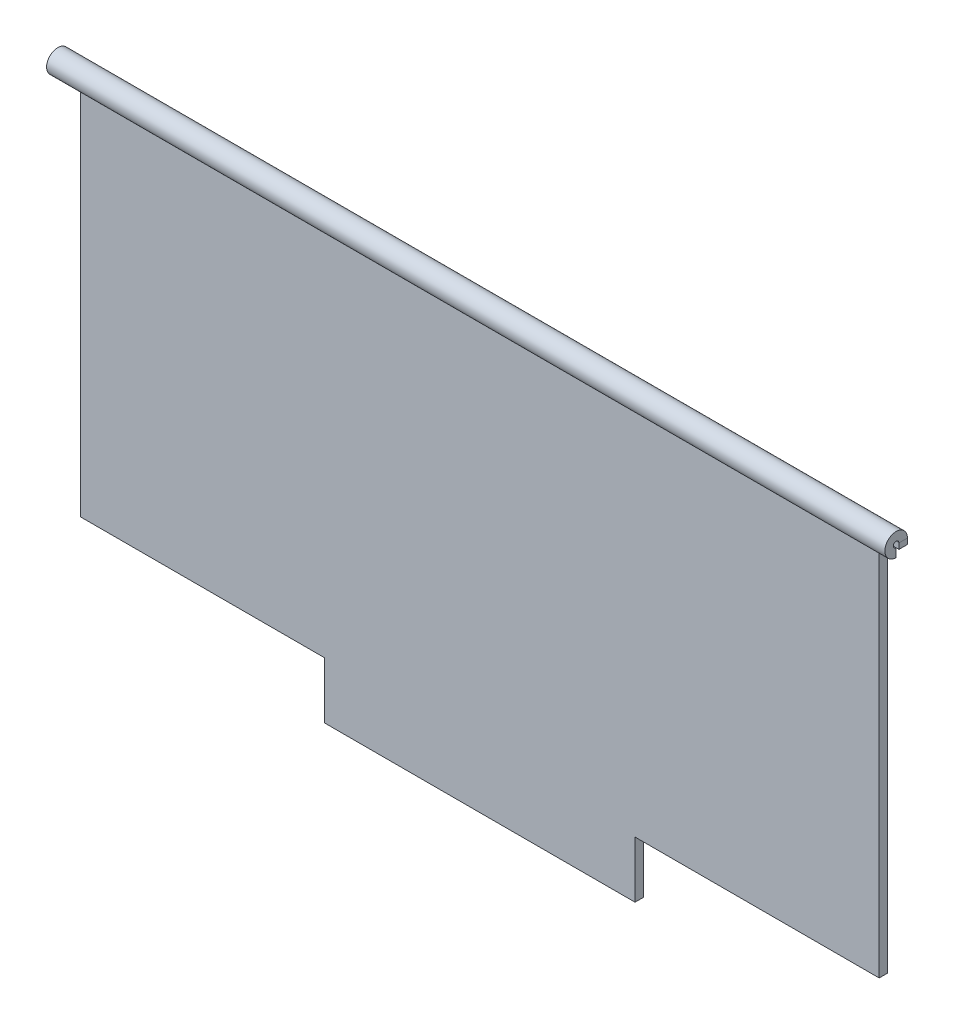
ISO-10303-21;
HEADER;
FILE_DESCRIPTION(('STEP AP214'),'2;1');
FILE_NAME('part.step','',(''),(''),'','','');
FILE_SCHEMA(('AUTOMOTIVE_DESIGN { 1 0 10303 214 1 1 1 1 }'));
ENDSEC;
DATA;
#1=APPLICATION_CONTEXT('core data for automotive mechanical design processes');
#2=APPLICATION_PROTOCOL_DEFINITION('international standard','automotive_design',2000,#1);
#3=PRODUCT_CONTEXT('',#1,'mechanical');
#4=PRODUCT('Part','Part','',(#3));
#5=PRODUCT_RELATED_PRODUCT_CATEGORY('part','',(#4));
#6=PRODUCT_DEFINITION_FORMATION('','',#4);
#7=PRODUCT_DEFINITION_CONTEXT('part definition',#1,'design');
#8=PRODUCT_DEFINITION('design','',#6,#7);
#9=PRODUCT_DEFINITION_SHAPE('','',#8);
#10=(LENGTH_UNIT() NAMED_UNIT(*) SI_UNIT(.MILLI.,.METRE.));
#11=(NAMED_UNIT(*) PLANE_ANGLE_UNIT() SI_UNIT($,.RADIAN.));
#12=(NAMED_UNIT(*) SI_UNIT($,.STERADIAN.) SOLID_ANGLE_UNIT());
#13=UNCERTAINTY_MEASURE_WITH_UNIT(LENGTH_MEASURE(1.E-05),#10,'distance_accuracy_value','');
#14=(GEOMETRIC_REPRESENTATION_CONTEXT(3) GLOBAL_UNCERTAINTY_ASSIGNED_CONTEXT((#13)) GLOBAL_UNIT_ASSIGNED_CONTEXT((#10,
#11,#12)) REPRESENTATION_CONTEXT('',''));
#15=CARTESIAN_POINT('',(0.,0.,0.));
#16=DIRECTION('',(0.,0.,1.));
#17=DIRECTION('',(1.,0.,0.));
#18=AXIS2_PLACEMENT_3D('',#15,#16,#17);
#19=CARTESIAN_POINT('',(-185.000354829546,-102.314393939394,-3.));
#20=DIRECTION('',(-1.,0.,0.));
#21=DIRECTION('',(0.,0.,1.));
#22=AXIS2_PLACEMENT_3D('',#19,#20,#21);
#23=PLANE('',#22);
#24=DIRECTION('',(0.,-1.,0.));
#25=VECTOR('',#24,1.);
#26=CARTESIAN_POINT('',(-185.000354829546,-102.314393939394,0.));
#27=LINE('',#26,#25);
#28=CARTESIAN_POINT('',(-185.000354829546,-106.314393939394,0.));
#29=VERTEX_POINT('',#28);
#30=CARTESIAN_POINT('',(-185.000354829546,-108.314393939394,0.));
#31=VERTEX_POINT('',#30);
#32=EDGE_CURVE('E109',#29,#31,#27,.T.);
#33=ORIENTED_EDGE('',*,*,#32,.F.);
#34=DIRECTION('',(0.,0.,-1.));
#35=VECTOR('',#34,1.);
#36=CARTESIAN_POINT('',(-185.000354829546,-106.314393939394,0.));
#37=LINE('',#36,#35);
#38=CARTESIAN_POINT('',(-185.000354829546,-106.314393939394,-3.));
#39=VERTEX_POINT('',#38);
#40=EDGE_CURVE('E439',#29,#39,#37,.T.);
#41=ORIENTED_EDGE('',*,*,#40,.T.);
#42=DIRECTION('',(0.,-1.,0.));
#43=VECTOR('',#42,1.);
#44=CARTESIAN_POINT('',(-185.000354829546,-102.314393939394,-3.));
#45=LINE('',#44,#43);
#46=CARTESIAN_POINT('',(-185.000354829546,-108.314393939394,-3.));
#47=VERTEX_POINT('',#46);
#48=EDGE_CURVE('E68',#39,#47,#45,.T.);
#49=ORIENTED_EDGE('',*,*,#48,.T.);
#50=DIRECTION('',(0.,0.,1.));
#51=VECTOR('',#50,1.);
#52=CARTESIAN_POINT('',(-185.000354829546,-108.314393939394,-3.));
#53=LINE('',#52,#51);
#54=EDGE_CURVE('E11',#47,#31,#53,.T.);
#55=ORIENTED_EDGE('',*,*,#54,.T.);
#56=EDGE_LOOP('',(#33,#41,#49,#55));
#57=FACE_BOUND('',#56,.T.);
#58=ADVANCED_FACE('F43',(#57),#23,.T.);
#59=CARTESIAN_POINT('',(-185.000354829546,-108.314393939394,-3.));
#60=DIRECTION('',(0.,-1.,0.));
#61=DIRECTION('',(0.,0.,-1.));
#62=AXIS2_PLACEMENT_3D('',#59,#60,#61);
#63=PLANE('',#62);
#64=DIRECTION('',(1.,0.,0.));
#65=VECTOR('',#64,1.);
#66=CARTESIAN_POINT('',(-185.000354829546,-108.314393939394,0.));
#67=LINE('',#66,#65);
#68=CARTESIAN_POINT('',(-178.000354829546,-108.314393939394,0.));
#69=VERTEX_POINT('',#68);
#70=EDGE_CURVE('E173',#31,#69,#67,.T.);
#71=ORIENTED_EDGE('',*,*,#70,.F.);
#72=ORIENTED_EDGE('',*,*,#54,.F.);
#73=DIRECTION('',(1.,0.,0.));
#74=VECTOR('',#73,1.);
#75=CARTESIAN_POINT('',(-185.000354829546,-108.314393939394,-3.));
#76=LINE('',#75,#74);
#77=CARTESIAN_POINT('',(-178.000354829546,-108.314393939394,-3.));
#78=VERTEX_POINT('',#77);
#79=EDGE_CURVE('E200',#47,#78,#76,.T.);
#80=ORIENTED_EDGE('',*,*,#79,.T.);
#81=DIRECTION('',(0.,0.,1.));
#82=VECTOR('',#81,1.);
#83=CARTESIAN_POINT('',(-178.000354829546,-108.314393939394,-3.));
#84=LINE('',#83,#82);
#85=EDGE_CURVE('E47',#78,#69,#84,.T.);
#86=ORIENTED_EDGE('',*,*,#85,.T.);
#87=EDGE_LOOP('',(#71,#72,#80,#86));
#88=FACE_BOUND('',#87,.T.);
#89=ADVANCED_FACE('F45',(#88),#63,.T.);
#90=CARTESIAN_POINT('',(111.999645170454,-102.314393939394,-3.));
#91=DIRECTION('',(1.,0.,0.));
#92=DIRECTION('',(0.,0.,-1.));
#93=AXIS2_PLACEMENT_3D('',#90,#91,#92);
#94=PLANE('',#93);
#95=DIRECTION('',(0.,0.,-1.));
#96=VECTOR('',#95,1.);
#97=CARTESIAN_POINT('',(111.999645170454,-106.314393939394,0.));
#98=LINE('',#97,#96);
#99=CARTESIAN_POINT('',(111.999645170454,-106.314393939394,0.));
#100=VERTEX_POINT('',#99);
#101=CARTESIAN_POINT('',(111.999645170454,-106.314393939394,-3.));
#102=VERTEX_POINT('',#101);
#103=EDGE_CURVE('E432',#100,#102,#98,.T.);
#104=ORIENTED_EDGE('',*,*,#103,.F.);
#105=DIRECTION('',(0.,1.,0.));
#106=VECTOR('',#105,1.);
#107=CARTESIAN_POINT('',(111.999645170454,-102.314393939394,0.));
#108=LINE('',#107,#106);
#109=CARTESIAN_POINT('',(111.999645170454,-108.314393939394,0.));
#110=VERTEX_POINT('',#109);
#111=EDGE_CURVE('E197',#110,#100,#108,.T.);
#112=ORIENTED_EDGE('',*,*,#111,.F.);
#113=DIRECTION('',(0.,0.,1.));
#114=VECTOR('',#113,1.);
#115=CARTESIAN_POINT('',(111.999645170454,-108.314393939394,-3.));
#116=LINE('',#115,#114);
#117=CARTESIAN_POINT('',(111.999645170454,-108.314393939394,-3.));
#118=VERTEX_POINT('',#117);
#119=EDGE_CURVE('E52',#118,#110,#116,.T.);
#120=ORIENTED_EDGE('',*,*,#119,.F.);
#121=DIRECTION('',(0.,1.,0.));
#122=VECTOR('',#121,1.);
#123=CARTESIAN_POINT('',(111.999645170454,-102.314393939394,-3.));
#124=LINE('',#123,#122);
#125=EDGE_CURVE('E162',#118,#102,#124,.T.);
#126=ORIENTED_EDGE('',*,*,#125,.T.);
#127=EDGE_LOOP('',(#104,#112,#120,#126));
#128=FACE_BOUND('',#127,.T.);
#129=ADVANCED_FACE('F239',(#128),#94,.T.);
#130=CARTESIAN_POINT('',(104.999645170454,-108.314393939394,-3.));
#131=DIRECTION('',(0.,-1.,0.));
#132=DIRECTION('',(0.,0.,-1.));
#133=AXIS2_PLACEMENT_3D('',#130,#131,#132);
#134=PLANE('',#133);
#135=DIRECTION('',(1.,0.,0.));
#136=VECTOR('',#135,1.);
#137=CARTESIAN_POINT('',(104.999645170454,-108.314393939394,0.));
#138=LINE('',#137,#136);
#139=CARTESIAN_POINT('',(104.999645170454,-108.314393939394,0.));
#140=VERTEX_POINT('',#139);
#141=EDGE_CURVE('E146',#140,#110,#138,.T.);
#142=ORIENTED_EDGE('',*,*,#141,.F.);
#143=DIRECTION('',(0.,0.,1.));
#144=VECTOR('',#143,1.);
#145=CARTESIAN_POINT('',(104.999645170454,-108.314393939394,-3.));
#146=LINE('',#145,#144);
#147=CARTESIAN_POINT('',(104.999645170454,-108.314393939394,-3.));
#148=VERTEX_POINT('',#147);
#149=EDGE_CURVE('E141',#148,#140,#146,.T.);
#150=ORIENTED_EDGE('',*,*,#149,.F.);
#151=DIRECTION('',(1.,0.,0.));
#152=VECTOR('',#151,1.);
#153=CARTESIAN_POINT('',(104.999645170454,-108.314393939394,-3.));
#154=LINE('',#153,#152);
#155=EDGE_CURVE('E144',#148,#118,#154,.T.);
#156=ORIENTED_EDGE('',*,*,#155,.T.);
#157=ORIENTED_EDGE('',*,*,#119,.T.);
#158=EDGE_LOOP('',(#142,#150,#156,#157));
#159=FACE_BOUND('',#158,.T.);
#160=ADVANCED_FACE('F143',(#159),#134,.T.);
#161=CARTESIAN_POINT('',(104.999645170454,-108.314393939394,-3.));
#162=DIRECTION('',(1.,0.,0.));
#163=DIRECTION('',(0.,0.,-1.));
#164=AXIS2_PLACEMENT_3D('',#161,#162,#163);
#165=PLANE('',#164);
#166=DIRECTION('',(0.,1.,0.));
#167=VECTOR('',#166,1.);
#168=CARTESIAN_POINT('',(104.999645170454,-108.314393939394,0.));
#169=LINE('',#168,#167);
#170=CARTESIAN_POINT('',(104.999645170454,-243.314393939394,0.));
#171=VERTEX_POINT('',#170);
#172=EDGE_CURVE('E194',#171,#140,#169,.T.);
#173=ORIENTED_EDGE('',*,*,#172,.F.);
#174=DIRECTION('',(0.,0.,1.));
#175=VECTOR('',#174,1.);
#176=CARTESIAN_POINT('',(104.999645170454,-243.314393939394,-3.));
#177=LINE('',#176,#175);
#178=CARTESIAN_POINT('',(104.999645170454,-243.314393939394,-3.));
#179=VERTEX_POINT('',#178);
#180=EDGE_CURVE('E151',#179,#171,#177,.T.);
#181=ORIENTED_EDGE('',*,*,#180,.F.);
#182=DIRECTION('',(0.,1.,0.));
#183=VECTOR('',#182,1.);
#184=CARTESIAN_POINT('',(104.999645170454,-108.314393939394,-3.));
#185=LINE('',#184,#183);
#186=EDGE_CURVE('E159',#179,#148,#185,.T.);
#187=ORIENTED_EDGE('',*,*,#186,.T.);
#188=ORIENTED_EDGE('',*,*,#149,.T.);
#189=EDGE_LOOP('',(#173,#181,#187,#188));
#190=FACE_BOUND('',#189,.T.);
#191=ADVANCED_FACE('F164',(#190),#165,.T.);
#192=CARTESIAN_POINT('',(18.4996451704545,-243.314393939394,-3.));
#193=DIRECTION('',(0.,-1.,0.));
#194=DIRECTION('',(0.,0.,-1.));
#195=AXIS2_PLACEMENT_3D('',#192,#193,#194);
#196=PLANE('',#195);
#197=DIRECTION('',(1.,0.,0.));
#198=VECTOR('',#197,1.);
#199=CARTESIAN_POINT('',(18.4996451704545,-243.314393939394,0.));
#200=LINE('',#199,#198);
#201=CARTESIAN_POINT('',(18.4996451704545,-243.314393939394,0.));
#202=VERTEX_POINT('',#201);
#203=EDGE_CURVE('E191',#202,#171,#200,.T.);
#204=ORIENTED_EDGE('',*,*,#203,.F.);
#205=DIRECTION('',(0.,0.,1.));
#206=VECTOR('',#205,1.);
#207=CARTESIAN_POINT('',(18.4996451704545,-243.314393939394,-3.));
#208=LINE('',#207,#206);
#209=CARTESIAN_POINT('',(18.4996451704545,-243.314393939394,-3.));
#210=VERTEX_POINT('',#209);
#211=EDGE_CURVE('E204',#210,#202,#208,.T.);
#212=ORIENTED_EDGE('',*,*,#211,.F.);
#213=DIRECTION('',(1.,0.,0.));
#214=VECTOR('',#213,1.);
#215=CARTESIAN_POINT('',(18.4996451704545,-243.314393939394,-3.));
#216=LINE('',#215,#214);
#217=EDGE_CURVE('E165',#210,#179,#216,.T.);
#218=ORIENTED_EDGE('',*,*,#217,.T.);
#219=ORIENTED_EDGE('',*,*,#180,.T.);
#220=EDGE_LOOP('',(#204,#212,#218,#219));
#221=FACE_BOUND('',#220,.T.);
#222=ADVANCED_FACE('F247',(#221),#196,.T.);
#223=CARTESIAN_POINT('',(18.4996451704545,-243.314393939394,-3.));
#224=DIRECTION('',(1.,0.,0.));
#225=DIRECTION('',(0.,0.,-1.));
#226=AXIS2_PLACEMENT_3D('',#223,#224,#225);
#227=PLANE('',#226);
#228=DIRECTION('',(0.,1.,0.));
#229=VECTOR('',#228,1.);
#230=CARTESIAN_POINT('',(18.4996451704545,-243.314393939394,0.));
#231=LINE('',#230,#229);
#232=CARTESIAN_POINT('',(18.4996451704545,-263.314393939394,0.));
#233=VERTEX_POINT('',#232);
#234=EDGE_CURVE('E188',#233,#202,#231,.T.);
#235=ORIENTED_EDGE('',*,*,#234,.F.);
#236=DIRECTION('',(0.,0.,1.));
#237=VECTOR('',#236,1.);
#238=CARTESIAN_POINT('',(18.4996451704545,-263.314393939394,-3.));
#239=LINE('',#238,#237);
#240=CARTESIAN_POINT('',(18.4996451704545,-263.314393939394,-3.));
#241=VERTEX_POINT('',#240);
#242=EDGE_CURVE('E206',#241,#233,#239,.T.);
#243=ORIENTED_EDGE('',*,*,#242,.F.);
#244=DIRECTION('',(0.,1.,0.));
#245=VECTOR('',#244,1.);
#246=CARTESIAN_POINT('',(18.4996451704545,-243.314393939394,-3.));
#247=LINE('',#246,#245);
#248=EDGE_CURVE('E167',#241,#210,#247,.T.);
#249=ORIENTED_EDGE('',*,*,#248,.T.);
#250=ORIENTED_EDGE('',*,*,#211,.T.);
#251=EDGE_LOOP('',(#235,#243,#249,#250));
#252=FACE_BOUND('',#251,.T.);
#253=ADVANCED_FACE('F250',(#252),#227,.T.);
#254=CARTESIAN_POINT('',(-91.5003548295455,-263.314393939394,-3.));
#255=DIRECTION('',(0.,-1.,0.));
#256=DIRECTION('',(0.,0.,-1.));
#257=AXIS2_PLACEMENT_3D('',#254,#255,#256);
#258=PLANE('',#257);
#259=DIRECTION('',(1.,0.,0.));
#260=VECTOR('',#259,1.);
#261=CARTESIAN_POINT('',(-91.5003548295455,-263.314393939394,0.));
#262=LINE('',#261,#260);
#263=CARTESIAN_POINT('',(-91.5003548295455,-263.314393939394,0.));
#264=VERTEX_POINT('',#263);
#265=EDGE_CURVE('E185',#264,#233,#262,.T.);
#266=ORIENTED_EDGE('',*,*,#265,.F.);
#267=DIRECTION('',(0.,0.,1.));
#268=VECTOR('',#267,1.);
#269=CARTESIAN_POINT('',(-91.5003548295455,-263.314393939394,-3.));
#270=LINE('',#269,#268);
#271=CARTESIAN_POINT('',(-91.5003548295455,-263.314393939394,-3.));
#272=VERTEX_POINT('',#271);
#273=EDGE_CURVE('E208',#272,#264,#270,.T.);
#274=ORIENTED_EDGE('',*,*,#273,.F.);
#275=DIRECTION('',(1.,0.,0.));
#276=VECTOR('',#275,1.);
#277=CARTESIAN_POINT('',(-91.5003548295455,-263.314393939394,-3.));
#278=LINE('',#277,#276);
#279=EDGE_CURVE('E459',#272,#241,#278,.T.);
#280=ORIENTED_EDGE('',*,*,#279,.T.);
#281=ORIENTED_EDGE('',*,*,#242,.T.);
#282=EDGE_LOOP('',(#266,#274,#280,#281));
#283=FACE_BOUND('',#282,.T.);
#284=ADVANCED_FACE('F254',(#283),#258,.T.);
#285=CARTESIAN_POINT('',(-91.5003548295455,-243.314393939394,-3.));
#286=DIRECTION('',(-1.,0.,0.));
#287=DIRECTION('',(0.,0.,1.));
#288=AXIS2_PLACEMENT_3D('',#285,#286,#287);
#289=PLANE('',#288);
#290=DIRECTION('',(0.,-1.,0.));
#291=VECTOR('',#290,1.);
#292=CARTESIAN_POINT('',(-91.5003548295455,-243.314393939394,0.));
#293=LINE('',#292,#291);
#294=CARTESIAN_POINT('',(-91.5003548295455,-243.314393939394,0.));
#295=VERTEX_POINT('',#294);
#296=EDGE_CURVE('E182',#295,#264,#293,.T.);
#297=ORIENTED_EDGE('',*,*,#296,.F.);
#298=DIRECTION('',(0.,0.,1.));
#299=VECTOR('',#298,1.);
#300=CARTESIAN_POINT('',(-91.5003548295455,-243.314393939394,-3.));
#301=LINE('',#300,#299);
#302=CARTESIAN_POINT('',(-91.5003548295455,-243.314393939394,-3.));
#303=VERTEX_POINT('',#302);
#304=EDGE_CURVE('E210',#303,#295,#301,.T.);
#305=ORIENTED_EDGE('',*,*,#304,.F.);
#306=DIRECTION('',(0.,-1.,0.));
#307=VECTOR('',#306,1.);
#308=CARTESIAN_POINT('',(-91.5003548295455,-243.314393939394,-3.));
#309=LINE('',#308,#307);
#310=EDGE_CURVE('E456',#303,#272,#309,.T.);
#311=ORIENTED_EDGE('',*,*,#310,.T.);
#312=ORIENTED_EDGE('',*,*,#273,.T.);
#313=EDGE_LOOP('',(#297,#305,#311,#312));
#314=FACE_BOUND('',#313,.T.);
#315=ADVANCED_FACE('F258',(#314),#289,.T.);
#316=CARTESIAN_POINT('',(-178.000354829546,-243.314393939394,-3.));
#317=DIRECTION('',(0.,-1.,0.));
#318=DIRECTION('',(0.,0.,-1.));
#319=AXIS2_PLACEMENT_3D('',#316,#317,#318);
#320=PLANE('',#319);
#321=DIRECTION('',(1.,0.,0.));
#322=VECTOR('',#321,1.);
#323=CARTESIAN_POINT('',(-178.000354829546,-243.314393939394,0.));
#324=LINE('',#323,#322);
#325=CARTESIAN_POINT('',(-178.000354829546,-243.314393939394,0.));
#326=VERTEX_POINT('',#325);
#327=EDGE_CURVE('E179',#326,#295,#324,.T.);
#328=ORIENTED_EDGE('',*,*,#327,.F.);
#329=DIRECTION('',(0.,0.,1.));
#330=VECTOR('',#329,1.);
#331=CARTESIAN_POINT('',(-178.000354829546,-243.314393939394,-3.));
#332=LINE('',#331,#330);
#333=CARTESIAN_POINT('',(-178.000354829546,-243.314393939394,-3.));
#334=VERTEX_POINT('',#333);
#335=EDGE_CURVE('E211',#334,#326,#332,.T.);
#336=ORIENTED_EDGE('',*,*,#335,.F.);
#337=DIRECTION('',(1.,0.,0.));
#338=VECTOR('',#337,1.);
#339=CARTESIAN_POINT('',(-178.000354829546,-243.314393939394,-3.));
#340=LINE('',#339,#338);
#341=EDGE_CURVE('E453',#334,#303,#340,.T.);
#342=ORIENTED_EDGE('',*,*,#341,.T.);
#343=ORIENTED_EDGE('',*,*,#304,.T.);
#344=EDGE_LOOP('',(#328,#336,#342,#343));
#345=FACE_BOUND('',#344,.T.);
#346=ADVANCED_FACE('F262',(#345),#320,.T.);
#347=CARTESIAN_POINT('',(-178.000354829546,-108.314393939394,-3.));
#348=DIRECTION('',(-1.,0.,0.));
#349=DIRECTION('',(0.,-1.,0.));
#350=AXIS2_PLACEMENT_3D('',#347,#348,#349);
#351=PLANE('',#350);
#352=DIRECTION('',(0.,-1.,0.));
#353=VECTOR('',#352,1.);
#354=CARTESIAN_POINT('',(-178.000354829546,-108.314393939394,0.));
#355=LINE('',#354,#353);
#356=EDGE_CURVE('E175',#69,#326,#355,.T.);
#357=ORIENTED_EDGE('',*,*,#356,.F.);
#358=ORIENTED_EDGE('',*,*,#85,.F.);
#359=DIRECTION('',(0.,-1.,0.));
#360=VECTOR('',#359,1.);
#361=CARTESIAN_POINT('',(-178.000354829546,-108.314393939394,-3.));
#362=LINE('',#361,#360);
#363=EDGE_CURVE('E451',#78,#334,#362,.T.);
#364=ORIENTED_EDGE('',*,*,#363,.T.);
#365=ORIENTED_EDGE('',*,*,#335,.T.);
#366=EDGE_LOOP('',(#357,#358,#364,#365));
#367=FACE_BOUND('',#366,.T.);
#368=ADVANCED_FACE('F217',(#367),#351,.T.);
#369=CARTESIAN_POINT('',(0.,0.,-3.));
#370=DIRECTION('',(0.,0.,-1.));
#371=DIRECTION('',(-1.,0.,0.));
#372=AXIS2_PLACEMENT_3D('',#369,#370,#371);
#373=PLANE('',#372);
#374=DIRECTION('',(-1.,0.,0.));
#375=VECTOR('',#374,1.);
#376=CARTESIAN_POINT('',(-185.000354829546,-106.314393939394,-3.));
#377=LINE('',#376,#375);
#378=EDGE_CURVE('E472',#39,#102,#377,.F.);
#379=ORIENTED_EDGE('',*,*,#378,.T.);
#380=ORIENTED_EDGE('',*,*,#125,.F.);
#381=ORIENTED_EDGE('',*,*,#155,.F.);
#382=ORIENTED_EDGE('',*,*,#186,.F.);
#383=ORIENTED_EDGE('',*,*,#217,.F.);
#384=ORIENTED_EDGE('',*,*,#248,.F.);
#385=ORIENTED_EDGE('',*,*,#279,.F.);
#386=ORIENTED_EDGE('',*,*,#310,.F.);
#387=ORIENTED_EDGE('',*,*,#341,.F.);
#388=ORIENTED_EDGE('',*,*,#363,.F.);
#389=ORIENTED_EDGE('',*,*,#79,.F.);
#390=ORIENTED_EDGE('',*,*,#48,.F.);
#391=EDGE_LOOP('',(#379,#380,#381,#382,#383,#384,#385,#386,#387,#388,#389,#390));
#392=FACE_BOUND('',#391,.T.);
#393=ADVANCED_FACE('F157',(#392),#373,.T.);
#394=CARTESIAN_POINT('',(0.,0.,0.));
#395=DIRECTION('',(0.,0.,-1.));
#396=DIRECTION('',(-1.,0.,0.));
#397=AXIS2_PLACEMENT_3D('',#394,#395,#396);
#398=PLANE('',#397);
#399=ORIENTED_EDGE('',*,*,#111,.T.);
#400=DIRECTION('',(-1.,0.,0.));
#401=VECTOR('',#400,1.);
#402=CARTESIAN_POINT('',(-185.000354829546,-106.314393939394,0.));
#403=LINE('',#402,#401);
#404=EDGE_CURVE('E421',#29,#100,#403,.F.);
#405=ORIENTED_EDGE('',*,*,#404,.F.);
#406=ORIENTED_EDGE('',*,*,#32,.T.);
#407=ORIENTED_EDGE('',*,*,#70,.T.);
#408=ORIENTED_EDGE('',*,*,#356,.T.);
#409=ORIENTED_EDGE('',*,*,#327,.T.);
#410=ORIENTED_EDGE('',*,*,#296,.T.);
#411=ORIENTED_EDGE('',*,*,#265,.T.);
#412=ORIENTED_EDGE('',*,*,#234,.T.);
#413=ORIENTED_EDGE('',*,*,#203,.T.);
#414=ORIENTED_EDGE('',*,*,#172,.T.);
#415=ORIENTED_EDGE('',*,*,#141,.T.);
#416=EDGE_LOOP('',(#399,#405,#406,#407,#408,#409,#410,#411,#412,#413,#414,#415));
#417=FACE_BOUND('',#416,.T.);
#418=ADVANCED_FACE('F218',(#417),#398,.F.);
#419=CARTESIAN_POINT('',(-36.5003548295455,-107.314393939394,0.99999999999999));
#420=DIRECTION('',(0.,0.,1.));
#421=DIRECTION('',(-1.,0.,0.));
#422=AXIS2_PLACEMENT_3D('',#419,#420,#421);
#423=PLANE('',#422);
#424=DIRECTION('',(0.,-1.,0.));
#425=VECTOR('',#424,1.);
#426=CARTESIAN_POINT('',(-185.000354829546,-107.314393939394,0.99999999999999));
#427=LINE('',#426,#425);
#428=CARTESIAN_POINT('',(-185.000354829546,-107.314393939394,0.99999999999999));
#429=VERTEX_POINT('',#428);
#430=CARTESIAN_POINT('',(-185.000354829546,-110.314393939394,0.999999999999959));
#431=VERTEX_POINT('',#430);
#432=EDGE_CURVE('E176',#429,#431,#427,.T.);
#433=ORIENTED_EDGE('',*,*,#432,.F.);
#434=DIRECTION('',(-1.,0.,0.));
#435=VECTOR('',#434,1.);
#436=CARTESIAN_POINT('',(-185.000354829546,-107.314393939394,0.99999999999999));
#437=LINE('',#436,#435);
#438=CARTESIAN_POINT('',(111.999645170454,-107.314393939394,0.99999999999999));
#439=VERTEX_POINT('',#438);
#440=EDGE_CURVE('E445',#439,#429,#437,.T.);
#441=ORIENTED_EDGE('',*,*,#440,.F.);
#442=DIRECTION('',(0.,-1.,0.));
#443=VECTOR('',#442,1.);
#444=CARTESIAN_POINT('',(111.999645170454,-107.314393939394,0.99999999999999));
#445=LINE('',#444,#443);
#446=CARTESIAN_POINT('',(111.999645170454,-110.314393939394,0.999999999999959));
#447=VERTEX_POINT('',#446);
#448=EDGE_CURVE('E435',#439,#447,#445,.T.);
#449=ORIENTED_EDGE('',*,*,#448,.T.);
#450=DIRECTION('',(-1.,0.,0.));
#451=VECTOR('',#450,1.);
#452=CARTESIAN_POINT('',(-185.000354829546,-110.314393939394,0.999999999999959));
#453=LINE('',#452,#451);
#454=EDGE_CURVE('E437',#447,#431,#453,.T.);
#455=ORIENTED_EDGE('',*,*,#454,.T.);
#456=EDGE_LOOP('',(#433,#441,#449,#455));
#457=FACE_BOUND('',#456,.T.);
#458=ADVANCED_FACE('F222',(#457),#423,.F.);
#459=CARTESIAN_POINT('',(111.999645170454,-106.314393939394,1.));
#460=DIRECTION('',(1.,0.,0.));
#461=DIRECTION('',(0.,0.,-1.));
#462=AXIS2_PLACEMENT_3D('',#459,#460,#461);
#463=PLANE('',#462);
#464=ORIENTED_EDGE('',*,*,#448,.F.);
#465=CARTESIAN_POINT('',(111.999645170454,-106.314393939394,1.));
#466=DIRECTION('',(-1.,0.,0.));
#467=DIRECTION('',(0.,0.,1.));
#468=AXIS2_PLACEMENT_3D('',#465,#466,#467);
#469=CIRCLE('',#468,1.);
#470=EDGE_CURVE('E424',#100,#439,#469,.F.);
#471=ORIENTED_EDGE('',*,*,#470,.F.);
#472=ORIENTED_EDGE('',*,*,#103,.T.);
#473=CARTESIAN_POINT('',(111.999645170454,-106.314393939394,1.));
#474=DIRECTION('',(-1.,0.,0.));
#475=DIRECTION('',(0.,0.,1.));
#476=AXIS2_PLACEMENT_3D('',#473,#474,#475);
#477=CIRCLE('',#476,4.);
#478=EDGE_CURVE('E442',#102,#447,#477,.F.);
#479=ORIENTED_EDGE('',*,*,#478,.T.);
#480=EDGE_LOOP('',(#464,#471,#472,#479));
#481=FACE_BOUND('',#480,.T.);
#482=ADVANCED_FACE('F228',(#481),#463,.T.);
#483=CARTESIAN_POINT('',(-185.000354829546,-106.314393939394,1.));
#484=DIRECTION('',(1.,0.,0.));
#485=DIRECTION('',(0.,0.,-1.));
#486=AXIS2_PLACEMENT_3D('',#483,#484,#485);
#487=PLANE('',#486);
#488=CARTESIAN_POINT('',(-185.000354829546,-106.314393939394,1.));
#489=DIRECTION('',(-1.,0.,0.));
#490=DIRECTION('',(0.,0.,1.));
#491=AXIS2_PLACEMENT_3D('',#488,#489,#490);
#492=CIRCLE('',#491,1.);
#493=EDGE_CURVE('E60',#429,#29,#492,.T.);
#494=ORIENTED_EDGE('',*,*,#493,.F.);
#495=ORIENTED_EDGE('',*,*,#432,.T.);
#496=CARTESIAN_POINT('',(-185.000354829546,-106.314393939394,1.));
#497=DIRECTION('',(-1.,0.,0.));
#498=DIRECTION('',(0.,0.,1.));
#499=AXIS2_PLACEMENT_3D('',#496,#497,#498);
#500=CIRCLE('',#499,4.);
#501=EDGE_CURVE('E484',#431,#39,#500,.T.);
#502=ORIENTED_EDGE('',*,*,#501,.T.);
#503=ORIENTED_EDGE('',*,*,#40,.F.);
#504=EDGE_LOOP('',(#494,#495,#502,#503));
#505=FACE_BOUND('',#504,.T.);
#506=ADVANCED_FACE('F350',(#505),#487,.F.);
#507=CARTESIAN_POINT('',(-185.000354829546,-106.314393939394,1.));
#508=DIRECTION('',(-1.,0.,0.));
#509=DIRECTION('',(0.,-1.,0.));
#510=AXIS2_PLACEMENT_3D('',#507,#508,#509);
#511=CYLINDRICAL_SURFACE('',#510,4.);
#512=ORIENTED_EDGE('',*,*,#378,.F.);
#513=ORIENTED_EDGE('',*,*,#501,.F.);
#514=ORIENTED_EDGE('',*,*,#454,.F.);
#515=ORIENTED_EDGE('',*,*,#478,.F.);
#516=EDGE_LOOP('',(#512,#513,#514,#515));
#517=FACE_BOUND('',#516,.T.);
#518=ADVANCED_FACE('F361',(#517),#511,.T.);
#519=CARTESIAN_POINT('',(-185.000354829546,-106.314393939394,1.));
#520=DIRECTION('',(-1.,0.,0.));
#521=DIRECTION('',(0.,-1.,0.));
#522=AXIS2_PLACEMENT_3D('',#519,#520,#521);
#523=CYLINDRICAL_SURFACE('',#522,1.);
#524=ORIENTED_EDGE('',*,*,#404,.T.);
#525=ORIENTED_EDGE('',*,*,#470,.T.);
#526=ORIENTED_EDGE('',*,*,#440,.T.);
#527=ORIENTED_EDGE('',*,*,#493,.T.);
#528=EDGE_LOOP('',(#524,#525,#526,#527));
#529=FACE_BOUND('',#528,.T.);
#530=ADVANCED_FACE('F372',(#529),#523,.F.);
#531=CLOSED_SHELL('',(#58,#89,#129,#160,#191,#222,#253,#284,#315,#346,#368,#393,#418,#458,#482,
#506,#518,#530));
#532=MANIFOLD_SOLID_BREP('B2',#531);
#533=ADVANCED_BREP_SHAPE_REPRESENTATION('',(#18,#532),#14);
#534=SHAPE_DEFINITION_REPRESENTATION(#9,#533);
ENDSEC;
END-ISO-10303-21;
